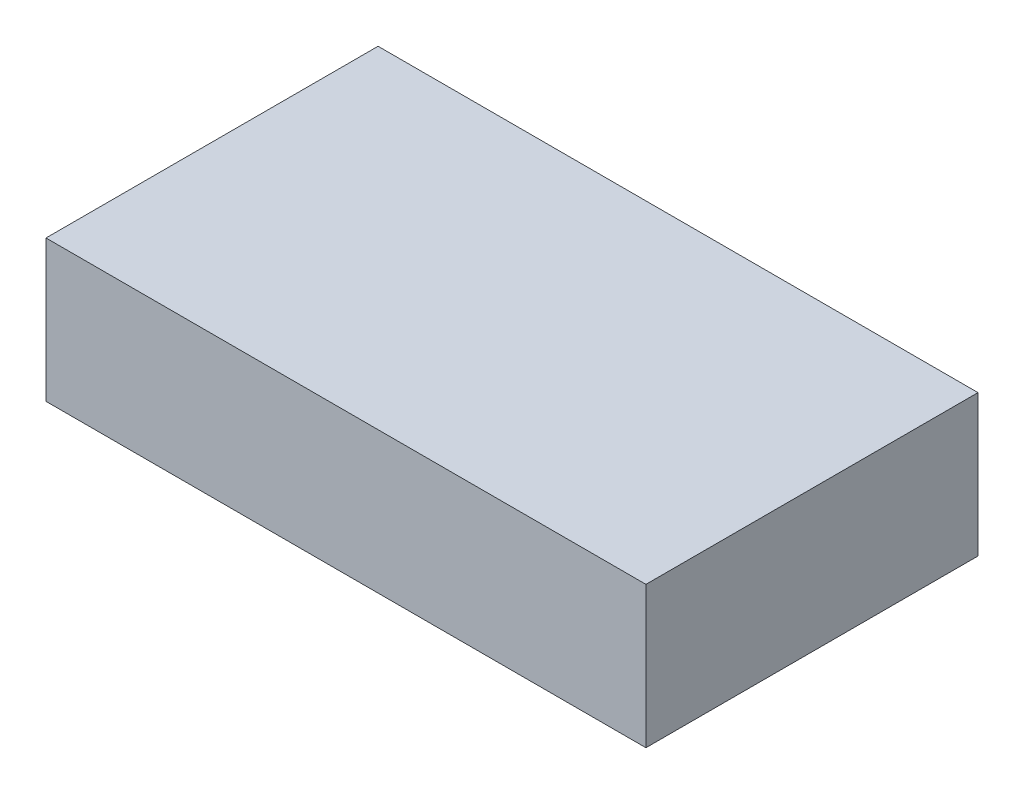
ISO-10303-21;
HEADER;
FILE_DESCRIPTION(('STEP AP214'),'2;1');
FILE_NAME('part.step','',(''),(''),'','','');
FILE_SCHEMA(('AUTOMOTIVE_DESIGN { 1 0 10303 214 1 1 1 1 }'));
ENDSEC;
DATA;
#1=APPLICATION_CONTEXT('core data for automotive mechanical design processes');
#2=APPLICATION_PROTOCOL_DEFINITION('international standard','automotive_design',2000,#1);
#3=PRODUCT_CONTEXT('',#1,'mechanical');
#4=PRODUCT('Part','Part','',(#3));
#5=PRODUCT_RELATED_PRODUCT_CATEGORY('part','',(#4));
#6=PRODUCT_DEFINITION_FORMATION('','',#4);
#7=PRODUCT_DEFINITION_CONTEXT('part definition',#1,'design');
#8=PRODUCT_DEFINITION('design','',#6,#7);
#9=PRODUCT_DEFINITION_SHAPE('','',#8);
#10=(LENGTH_UNIT() NAMED_UNIT(*) SI_UNIT(.MILLI.,.METRE.));
#11=(NAMED_UNIT(*) PLANE_ANGLE_UNIT() SI_UNIT($,.RADIAN.));
#12=(NAMED_UNIT(*) SI_UNIT($,.STERADIAN.) SOLID_ANGLE_UNIT());
#13=UNCERTAINTY_MEASURE_WITH_UNIT(LENGTH_MEASURE(1.E-05),#10,'distance_accuracy_value','');
#14=(GEOMETRIC_REPRESENTATION_CONTEXT(3) GLOBAL_UNCERTAINTY_ASSIGNED_CONTEXT((#13)) GLOBAL_UNIT_ASSIGNED_CONTEXT((#10,
#11,#12)) REPRESENTATION_CONTEXT('',''));
#15=CARTESIAN_POINT('',(0.,0.,0.));
#16=DIRECTION('',(0.,0.,1.));
#17=DIRECTION('',(1.,0.,0.));
#18=AXIS2_PLACEMENT_3D('',#15,#16,#17);
#19=CARTESIAN_POINT('',(38.3,18.07,21.2));
#20=DIRECTION('',(-1.,0.,0.));
#21=DIRECTION('',(0.,0.,1.));
#22=AXIS2_PLACEMENT_3D('',#19,#20,#21);
#23=PLANE('',#22);
#24=DIRECTION('',(0.,0.,-1.));
#25=VECTOR('',#24,1.);
#26=CARTESIAN_POINT('',(38.3,0.,21.2));
#27=LINE('',#26,#25);
#28=CARTESIAN_POINT('',(38.3,0.,21.2));
#29=VERTEX_POINT('',#28);
#30=CARTESIAN_POINT('',(38.3,0.,-21.2));
#31=VERTEX_POINT('',#30);
#32=EDGE_CURVE('E103',#29,#31,#27,.T.);
#33=ORIENTED_EDGE('',*,*,#32,.T.);
#34=DIRECTION('',(0.,-1.,0.));
#35=VECTOR('',#34,1.);
#36=CARTESIAN_POINT('',(38.3,18.07,-21.2));
#37=LINE('',#36,#35);
#38=CARTESIAN_POINT('',(38.3,18.07,-21.2));
#39=VERTEX_POINT('',#38);
#40=EDGE_CURVE('E11',#39,#31,#37,.T.);
#41=ORIENTED_EDGE('',*,*,#40,.F.);
#42=DIRECTION('',(0.,0.,-1.));
#43=VECTOR('',#42,1.);
#44=CARTESIAN_POINT('',(38.3,18.07,21.2));
#45=LINE('',#44,#43);
#46=CARTESIAN_POINT('',(38.3,18.07,21.2));
#47=VERTEX_POINT('',#46);
#48=EDGE_CURVE('E91',#47,#39,#45,.T.);
#49=ORIENTED_EDGE('',*,*,#48,.F.);
#50=DIRECTION('',(0.,-1.,0.));
#51=VECTOR('',#50,1.);
#52=CARTESIAN_POINT('',(38.3,18.07,21.2));
#53=LINE('',#52,#51);
#54=EDGE_CURVE('E99',#47,#29,#53,.T.);
#55=ORIENTED_EDGE('',*,*,#54,.T.);
#56=EDGE_LOOP('',(#33,#41,#49,#55));
#57=FACE_BOUND('',#56,.T.);
#58=ADVANCED_FACE('F40',(#57),#23,.F.);
#59=CARTESIAN_POINT('',(-38.3,18.07,-21.2));
#60=DIRECTION('',(0.,0.,1.));
#61=DIRECTION('',(1.,0.,0.));
#62=AXIS2_PLACEMENT_3D('',#59,#60,#61);
#63=PLANE('',#62);
#64=DIRECTION('',(-1.,0.,0.));
#65=VECTOR('',#64,1.);
#66=CARTESIAN_POINT('',(-38.3,0.,-21.2));
#67=LINE('',#66,#65);
#68=CARTESIAN_POINT('',(-38.3,0.,-21.2));
#69=VERTEX_POINT('',#68);
#70=EDGE_CURVE('E95',#31,#69,#67,.T.);
#71=ORIENTED_EDGE('',*,*,#70,.T.);
#72=DIRECTION('',(0.,-1.,0.));
#73=VECTOR('',#72,1.);
#74=CARTESIAN_POINT('',(-38.3,18.07,-21.2));
#75=LINE('',#74,#73);
#76=CARTESIAN_POINT('',(-38.3,18.07,-21.2));
#77=VERTEX_POINT('',#76);
#78=EDGE_CURVE('E48',#77,#69,#75,.T.);
#79=ORIENTED_EDGE('',*,*,#78,.F.);
#80=DIRECTION('',(-1.,0.,0.));
#81=VECTOR('',#80,1.);
#82=CARTESIAN_POINT('',(-38.3,18.07,-21.2));
#83=LINE('',#82,#81);
#84=EDGE_CURVE('E86',#39,#77,#83,.T.);
#85=ORIENTED_EDGE('',*,*,#84,.F.);
#86=ORIENTED_EDGE('',*,*,#40,.T.);
#87=EDGE_LOOP('',(#71,#79,#85,#86));
#88=FACE_BOUND('',#87,.T.);
#89=ADVANCED_FACE('F94',(#88),#63,.F.);
#90=CARTESIAN_POINT('',(-38.3,18.07,21.2));
#91=DIRECTION('',(1.,0.,0.));
#92=DIRECTION('',(0.,0.,-1.));
#93=AXIS2_PLACEMENT_3D('',#90,#91,#92);
#94=PLANE('',#93);
#95=DIRECTION('',(0.,0.,1.));
#96=VECTOR('',#95,1.);
#97=CARTESIAN_POINT('',(-38.3,0.,21.2));
#98=LINE('',#97,#96);
#99=CARTESIAN_POINT('',(-38.3,0.,21.2));
#100=VERTEX_POINT('',#99);
#101=EDGE_CURVE('E73',#69,#100,#98,.T.);
#102=ORIENTED_EDGE('',*,*,#101,.T.);
#103=DIRECTION('',(0.,-1.,0.));
#104=VECTOR('',#103,1.);
#105=CARTESIAN_POINT('',(-38.3,18.07,21.2));
#106=LINE('',#105,#104);
#107=CARTESIAN_POINT('',(-38.3,18.07,21.2));
#108=VERTEX_POINT('',#107);
#109=EDGE_CURVE('E96',#108,#100,#106,.T.);
#110=ORIENTED_EDGE('',*,*,#109,.F.);
#111=DIRECTION('',(0.,0.,1.));
#112=VECTOR('',#111,1.);
#113=CARTESIAN_POINT('',(-38.3,18.07,21.2));
#114=LINE('',#113,#112);
#115=EDGE_CURVE('E89',#77,#108,#114,.T.);
#116=ORIENTED_EDGE('',*,*,#115,.F.);
#117=ORIENTED_EDGE('',*,*,#78,.T.);
#118=EDGE_LOOP('',(#102,#110,#116,#117));
#119=FACE_BOUND('',#118,.T.);
#120=ADVANCED_FACE('F97',(#119),#94,.F.);
#121=CARTESIAN_POINT('',(-38.3,18.07,21.2));
#122=DIRECTION('',(0.,0.,-1.));
#123=DIRECTION('',(-1.,0.,0.));
#124=AXIS2_PLACEMENT_3D('',#121,#122,#123);
#125=PLANE('',#124);
#126=DIRECTION('',(1.,0.,0.));
#127=VECTOR('',#126,1.);
#128=CARTESIAN_POINT('',(-38.3,0.,21.2));
#129=LINE('',#128,#127);
#130=EDGE_CURVE('E79',#100,#29,#129,.T.);
#131=ORIENTED_EDGE('',*,*,#130,.T.);
#132=ORIENTED_EDGE('',*,*,#54,.F.);
#133=DIRECTION('',(1.,0.,0.));
#134=VECTOR('',#133,1.);
#135=CARTESIAN_POINT('',(-38.3,18.07,21.2));
#136=LINE('',#135,#134);
#137=EDGE_CURVE('E56',#108,#47,#136,.T.);
#138=ORIENTED_EDGE('',*,*,#137,.F.);
#139=ORIENTED_EDGE('',*,*,#109,.T.);
#140=EDGE_LOOP('',(#131,#132,#138,#139));
#141=FACE_BOUND('',#140,.T.);
#142=ADVANCED_FACE('F110',(#141),#125,.F.);
#143=CARTESIAN_POINT('',(0.,18.07,0.));
#144=DIRECTION('',(0.,-1.,0.));
#145=DIRECTION('',(0.,0.,-1.));
#146=AXIS2_PLACEMENT_3D('',#143,#144,#145);
#147=PLANE('',#146);
#148=ORIENTED_EDGE('',*,*,#48,.T.);
#149=ORIENTED_EDGE('',*,*,#84,.T.);
#150=ORIENTED_EDGE('',*,*,#115,.T.);
#151=ORIENTED_EDGE('',*,*,#137,.T.);
#152=EDGE_LOOP('',(#148,#149,#150,#151));
#153=FACE_BOUND('',#152,.T.);
#154=ADVANCED_FACE('F87',(#153),#147,.F.);
#155=CARTESIAN_POINT('',(0.,0.,0.));
#156=DIRECTION('',(0.,-1.,0.));
#157=DIRECTION('',(0.,0.,-1.));
#158=AXIS2_PLACEMENT_3D('',#155,#156,#157);
#159=PLANE('',#158);
#160=ORIENTED_EDGE('',*,*,#32,.F.);
#161=ORIENTED_EDGE('',*,*,#130,.F.);
#162=ORIENTED_EDGE('',*,*,#101,.F.);
#163=ORIENTED_EDGE('',*,*,#70,.F.);
#164=EDGE_LOOP('',(#160,#161,#162,#163));
#165=FACE_BOUND('',#164,.T.);
#166=ADVANCED_FACE('F113',(#165),#159,.T.);
#167=CLOSED_SHELL('',(#58,#89,#120,#142,#154,#166));
#168=MANIFOLD_SOLID_BREP('B2',#167);
#169=ADVANCED_BREP_SHAPE_REPRESENTATION('',(#18,#168),#14);
#170=SHAPE_DEFINITION_REPRESENTATION(#9,#169);
ENDSEC;
END-ISO-10303-21;
